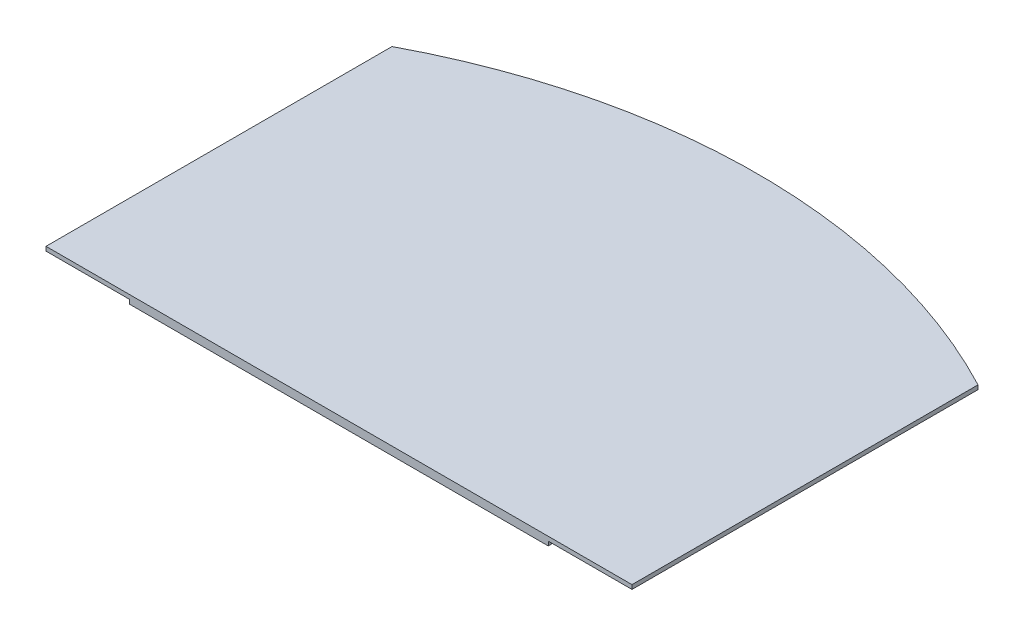
ISO-10303-21;
HEADER;
FILE_DESCRIPTION(('STEP AP214'),'2;1');
FILE_NAME('part.step','',(''),(''),'','','');
FILE_SCHEMA(('AUTOMOTIVE_DESIGN { 1 0 10303 214 1 1 1 1 }'));
ENDSEC;
DATA;
#1=APPLICATION_CONTEXT('core data for automotive mechanical design processes');
#2=APPLICATION_PROTOCOL_DEFINITION('international standard','automotive_design',2000,#1);
#3=PRODUCT_CONTEXT('',#1,'mechanical');
#4=PRODUCT('Part','Part','',(#3));
#5=PRODUCT_RELATED_PRODUCT_CATEGORY('part','',(#4));
#6=PRODUCT_DEFINITION_FORMATION('','',#4);
#7=PRODUCT_DEFINITION_CONTEXT('part definition',#1,'design');
#8=PRODUCT_DEFINITION('design','',#6,#7);
#9=PRODUCT_DEFINITION_SHAPE('','',#8);
#10=(LENGTH_UNIT() NAMED_UNIT(*) SI_UNIT(.MILLI.,.METRE.));
#11=(NAMED_UNIT(*) PLANE_ANGLE_UNIT() SI_UNIT($,.RADIAN.));
#12=(NAMED_UNIT(*) SI_UNIT($,.STERADIAN.) SOLID_ANGLE_UNIT());
#13=UNCERTAINTY_MEASURE_WITH_UNIT(LENGTH_MEASURE(1.E-05),#10,'distance_accuracy_value','');
#14=(GEOMETRIC_REPRESENTATION_CONTEXT(3) GLOBAL_UNCERTAINTY_ASSIGNED_CONTEXT((#13)) GLOBAL_UNIT_ASSIGNED_CONTEXT((#10,
#11,#12)) REPRESENTATION_CONTEXT('',''));
#15=CARTESIAN_POINT('',(0.,0.,0.));
#16=DIRECTION('',(0.,0.,1.));
#17=DIRECTION('',(1.,0.,0.));
#18=AXIS2_PLACEMENT_3D('',#15,#16,#17);
#19=CARTESIAN_POINT('',(70.,2.,-89.9792049636934));
#20=DIRECTION('',(-1.,0.,0.));
#21=DIRECTION('',(0.,0.,1.));
#22=AXIS2_PLACEMENT_3D('',#19,#20,#21);
#23=PLANE('',#22);
#24=DIRECTION('',(0.,0.,1.));
#25=VECTOR('',#24,1.);
#26=CARTESIAN_POINT('',(70.,1.,-222.143502841512));
#27=LINE('',#26,#25);
#28=CARTESIAN_POINT('',(70.,1.,-132.664991614216));
#29=VERTEX_POINT('',#28);
#30=CARTESIAN_POINT('',(70.,1.,-50.));
#31=VERTEX_POINT('',#30);
#32=EDGE_CURVE('E143',#29,#31,#27,.T.);
#33=ORIENTED_EDGE('',*,*,#32,.F.);
#34=DIRECTION('',(0.,-1.,0.));
#35=VECTOR('',#34,1.);
#36=CARTESIAN_POINT('',(70.,2.,-132.664991614216));
#37=LINE('',#36,#35);
#38=CARTESIAN_POINT('',(70.,2.,-132.664991614216));
#39=VERTEX_POINT('',#38);
#40=EDGE_CURVE('E43',#39,#29,#37,.T.);
#41=ORIENTED_EDGE('',*,*,#40,.F.);
#42=DIRECTION('',(0.,0.,-1.));
#43=VECTOR('',#42,1.);
#44=CARTESIAN_POINT('',(70.,2.,-89.9792049636934));
#45=LINE('',#44,#43);
#46=CARTESIAN_POINT('',(70.,2.,-50.));
#47=VERTEX_POINT('',#46);
#48=EDGE_CURVE('E125',#47,#39,#45,.T.);
#49=ORIENTED_EDGE('',*,*,#48,.F.);
#50=DIRECTION('',(0.,-1.,0.));
#51=VECTOR('',#50,1.);
#52=CARTESIAN_POINT('',(70.,2.,-50.));
#53=LINE('',#52,#51);
#54=EDGE_CURVE('E11',#47,#31,#53,.T.);
#55=ORIENTED_EDGE('',*,*,#54,.T.);
#56=EDGE_LOOP('',(#33,#41,#49,#55));
#57=FACE_BOUND('',#56,.T.);
#58=ADVANCED_FACE('F35',(#57),#23,.F.);
#59=CARTESIAN_POINT('',(0.,2.,0.));
#60=DIRECTION('',(0.,-1.,0.));
#61=DIRECTION('',(0.,0.,-1.));
#62=AXIS2_PLACEMENT_3D('',#59,#60,#61);
#63=CYLINDRICAL_SURFACE('',#62,150.);
#64=CARTESIAN_POINT('',(0.,1.,0.));
#65=DIRECTION('',(0.,-1.,0.));
#66=DIRECTION('',(0.,0.,-1.));
#67=AXIS2_PLACEMENT_3D('',#64,#65,#66);
#68=CIRCLE('',#67,150.);
#69=CARTESIAN_POINT('',(50.,1.,-141.42135623731));
#70=VERTEX_POINT('',#69);
#71=EDGE_CURVE('E50',#70,#29,#68,.T.);
#72=ORIENTED_EDGE('',*,*,#71,.F.);
#73=DIRECTION('',(0.,-1.,0.));
#74=VECTOR('',#73,1.);
#75=CARTESIAN_POINT('',(50.,1.,-141.42135623731));
#76=LINE('',#75,#74);
#77=CARTESIAN_POINT('',(50.,0.,-141.42135623731));
#78=VERTEX_POINT('',#77);
#79=EDGE_CURVE('E147',#70,#78,#76,.T.);
#80=ORIENTED_EDGE('',*,*,#79,.T.);
#81=CARTESIAN_POINT('',(0.,0.,0.));
#82=DIRECTION('',(0.,1.,0.));
#83=DIRECTION('',(0.,0.,1.));
#84=AXIS2_PLACEMENT_3D('',#81,#82,#83);
#85=CIRCLE('',#84,150.);
#86=CARTESIAN_POINT('',(-50.,0.,-141.42135623731));
#87=VERTEX_POINT('',#86);
#88=EDGE_CURVE('E58',#78,#87,#85,.T.);
#89=ORIENTED_EDGE('',*,*,#88,.T.);
#90=DIRECTION('',(0.,-1.,0.));
#91=VECTOR('',#90,1.);
#92=CARTESIAN_POINT('',(-50.,1.,-141.42135623731));
#93=LINE('',#92,#91);
#94=CARTESIAN_POINT('',(-50.,1.,-141.42135623731));
#95=VERTEX_POINT('',#94);
#96=EDGE_CURVE('E122',#95,#87,#93,.T.);
#97=ORIENTED_EDGE('',*,*,#96,.F.);
#98=CARTESIAN_POINT('',(0.,1.,0.));
#99=DIRECTION('',(0.,-1.,0.));
#100=DIRECTION('',(0.,0.,-1.));
#101=AXIS2_PLACEMENT_3D('',#98,#99,#100);
#102=CIRCLE('',#101,150.);
#103=CARTESIAN_POINT('',(-70.,1.,-132.664991614216));
#104=VERTEX_POINT('',#103);
#105=EDGE_CURVE('E159',#104,#95,#102,.T.);
#106=ORIENTED_EDGE('',*,*,#105,.F.);
#107=DIRECTION('',(0.,-1.,0.));
#108=VECTOR('',#107,1.);
#109=CARTESIAN_POINT('',(-70.,2.,-132.664991614216));
#110=LINE('',#109,#108);
#111=CARTESIAN_POINT('',(-70.,2.,-132.664991614216));
#112=VERTEX_POINT('',#111);
#113=EDGE_CURVE('E132',#112,#104,#110,.T.);
#114=ORIENTED_EDGE('',*,*,#113,.F.);
#115=CARTESIAN_POINT('',(0.,2.,0.));
#116=DIRECTION('',(0.,1.,0.));
#117=DIRECTION('',(0.,0.,1.));
#118=AXIS2_PLACEMENT_3D('',#115,#116,#117);
#119=CIRCLE('',#118,150.);
#120=EDGE_CURVE('E140',#39,#112,#119,.T.);
#121=ORIENTED_EDGE('',*,*,#120,.F.);
#122=ORIENTED_EDGE('',*,*,#40,.T.);
#123=EDGE_LOOP('',(#72,#80,#89,#97,#106,#114,#121,#122));
#124=FACE_BOUND('',#123,.T.);
#125=ADVANCED_FACE('F138',(#124),#63,.T.);
#126=CARTESIAN_POINT('',(-70.,2.,-89.9792049636934));
#127=DIRECTION('',(-1.,0.,0.));
#128=DIRECTION('',(0.,0.,1.));
#129=AXIS2_PLACEMENT_3D('',#126,#127,#128);
#130=PLANE('',#129);
#131=ORIENTED_EDGE('',*,*,#113,.T.);
#132=DIRECTION('',(0.,0.,-1.));
#133=VECTOR('',#132,1.);
#134=CARTESIAN_POINT('',(-70.,1.,-233.564134102725));
#135=LINE('',#134,#133);
#136=CARTESIAN_POINT('',(-70.,1.,-50.));
#137=VERTEX_POINT('',#136);
#138=EDGE_CURVE('E157',#137,#104,#135,.T.);
#139=ORIENTED_EDGE('',*,*,#138,.F.);
#140=DIRECTION('',(0.,-1.,0.));
#141=VECTOR('',#140,1.);
#142=CARTESIAN_POINT('',(-70.,2.,-50.));
#143=LINE('',#142,#141);
#144=CARTESIAN_POINT('',(-70.,2.,-50.));
#145=VERTEX_POINT('',#144);
#146=EDGE_CURVE('E130',#145,#137,#143,.T.);
#147=ORIENTED_EDGE('',*,*,#146,.F.);
#148=DIRECTION('',(0.,0.,-1.));
#149=VECTOR('',#148,1.);
#150=CARTESIAN_POINT('',(-70.,2.,-89.9792049636934));
#151=LINE('',#150,#149);
#152=EDGE_CURVE('E133',#145,#112,#151,.T.);
#153=ORIENTED_EDGE('',*,*,#152,.T.);
#154=EDGE_LOOP('',(#131,#139,#147,#153));
#155=FACE_BOUND('',#154,.T.);
#156=ADVANCED_FACE('F177',(#155),#130,.T.);
#157=CARTESIAN_POINT('',(-143.584929139032,2.,-50.));
#158=DIRECTION('',(0.,0.,1.));
#159=DIRECTION('',(1.,0.,0.));
#160=AXIS2_PLACEMENT_3D('',#157,#158,#159);
#161=PLANE('',#160);
#162=ORIENTED_EDGE('',*,*,#146,.T.);
#163=DIRECTION('',(-1.,0.,0.));
#164=VECTOR('',#163,1.);
#165=CARTESIAN_POINT('',(0.,1.,-50.));
#166=LINE('',#165,#164);
#167=CARTESIAN_POINT('',(-50.,1.,-50.));
#168=VERTEX_POINT('',#167);
#169=EDGE_CURVE('E108',#168,#137,#166,.T.);
#170=ORIENTED_EDGE('',*,*,#169,.F.);
#171=DIRECTION('',(0.,-1.,0.));
#172=VECTOR('',#171,1.);
#173=CARTESIAN_POINT('',(-50.,2.,-50.));
#174=LINE('',#173,#172);
#175=CARTESIAN_POINT('',(-50.,0.,-50.));
#176=VERTEX_POINT('',#175);
#177=EDGE_CURVE('E102',#168,#176,#174,.T.);
#178=ORIENTED_EDGE('',*,*,#177,.T.);
#179=DIRECTION('',(1.,0.,0.));
#180=VECTOR('',#179,1.);
#181=CARTESIAN_POINT('',(-50.,0.,-50.));
#182=LINE('',#181,#180);
#183=CARTESIAN_POINT('',(50.,0.,-50.));
#184=VERTEX_POINT('',#183);
#185=EDGE_CURVE('E106',#176,#184,#182,.T.);
#186=ORIENTED_EDGE('',*,*,#185,.T.);
#187=DIRECTION('',(0.,-1.,0.));
#188=VECTOR('',#187,1.);
#189=CARTESIAN_POINT('',(50.,2.,-50.));
#190=LINE('',#189,#188);
#191=CARTESIAN_POINT('',(50.,1.,-50.));
#192=VERTEX_POINT('',#191);
#193=EDGE_CURVE('E112',#192,#184,#190,.T.);
#194=ORIENTED_EDGE('',*,*,#193,.F.);
#195=DIRECTION('',(-1.,0.,0.));
#196=VECTOR('',#195,1.);
#197=CARTESIAN_POINT('',(10.,1.,-50.));
#198=LINE('',#197,#196);
#199=EDGE_CURVE('E168',#31,#192,#198,.T.);
#200=ORIENTED_EDGE('',*,*,#199,.F.);
#201=ORIENTED_EDGE('',*,*,#54,.F.);
#202=DIRECTION('',(1.,0.,0.));
#203=VECTOR('',#202,1.);
#204=CARTESIAN_POINT('',(-143.584929139032,2.,-50.));
#205=LINE('',#204,#203);
#206=EDGE_CURVE('E123',#145,#47,#205,.T.);
#207=ORIENTED_EDGE('',*,*,#206,.F.);
#208=EDGE_LOOP('',(#162,#170,#178,#186,#194,#200,#201,#207));
#209=FACE_BOUND('',#208,.T.);
#210=ADVANCED_FACE('F105',(#209),#161,.T.);
#211=CARTESIAN_POINT('',(-143.584929139032,0.,-89.9792049636934));
#212=DIRECTION('',(0.,1.,0.));
#213=DIRECTION('',(0.,0.,1.));
#214=AXIS2_PLACEMENT_3D('',#211,#212,#213);
#215=PLANE('',#214);
#216=DIRECTION('',(0.,0.,-1.));
#217=VECTOR('',#216,1.);
#218=CARTESIAN_POINT('',(50.,0.,-89.9792049636934));
#219=LINE('',#218,#217);
#220=EDGE_CURVE('E119',#184,#78,#219,.T.);
#221=ORIENTED_EDGE('',*,*,#220,.F.);
#222=ORIENTED_EDGE('',*,*,#185,.F.);
#223=DIRECTION('',(0.,0.,1.));
#224=VECTOR('',#223,1.);
#225=CARTESIAN_POINT('',(-50.,0.,-89.9792049636934));
#226=LINE('',#225,#224);
#227=EDGE_CURVE('E117',#87,#176,#226,.T.);
#228=ORIENTED_EDGE('',*,*,#227,.F.);
#229=ORIENTED_EDGE('',*,*,#88,.F.);
#230=EDGE_LOOP('',(#221,#222,#228,#229));
#231=FACE_BOUND('',#230,.T.);
#232=ADVANCED_FACE('F116',(#231),#215,.F.);
#233=CARTESIAN_POINT('',(50.,2.,-89.9792049636934));
#234=DIRECTION('',(-1.,0.,0.));
#235=DIRECTION('',(0.,0.,1.));
#236=AXIS2_PLACEMENT_3D('',#233,#234,#235);
#237=PLANE('',#236);
#238=DIRECTION('',(0.,0.,-1.));
#239=VECTOR('',#238,1.);
#240=CARTESIAN_POINT('',(50.,1.,-222.143502841512));
#241=LINE('',#240,#239);
#242=EDGE_CURVE('E151',#192,#70,#241,.T.);
#243=ORIENTED_EDGE('',*,*,#242,.F.);
#244=ORIENTED_EDGE('',*,*,#193,.T.);
#245=ORIENTED_EDGE('',*,*,#220,.T.);
#246=ORIENTED_EDGE('',*,*,#79,.F.);
#247=EDGE_LOOP('',(#243,#244,#245,#246));
#248=FACE_BOUND('',#247,.T.);
#249=ADVANCED_FACE('F37',(#248),#237,.F.);
#250=CARTESIAN_POINT('',(-50.,2.,-89.9792049636934));
#251=DIRECTION('',(1.,0.,0.));
#252=DIRECTION('',(0.,0.,-1.));
#253=AXIS2_PLACEMENT_3D('',#250,#251,#252);
#254=PLANE('',#253);
#255=ORIENTED_EDGE('',*,*,#227,.T.);
#256=ORIENTED_EDGE('',*,*,#177,.F.);
#257=DIRECTION('',(0.,0.,-1.));
#258=VECTOR('',#257,1.);
#259=CARTESIAN_POINT('',(-50.,1.,-233.564134102725));
#260=LINE('',#259,#258);
#261=EDGE_CURVE('E149',#168,#95,#260,.T.);
#262=ORIENTED_EDGE('',*,*,#261,.T.);
#263=ORIENTED_EDGE('',*,*,#96,.T.);
#264=EDGE_LOOP('',(#255,#256,#262,#263));
#265=FACE_BOUND('',#264,.T.);
#266=ADVANCED_FACE('F121',(#265),#254,.F.);
#267=CARTESIAN_POINT('',(-143.584929139032,2.,-89.9792049636934));
#268=DIRECTION('',(0.,1.,0.));
#269=DIRECTION('',(0.,0.,1.));
#270=AXIS2_PLACEMENT_3D('',#267,#268,#269);
#271=PLANE('',#270);
#272=ORIENTED_EDGE('',*,*,#152,.F.);
#273=ORIENTED_EDGE('',*,*,#206,.T.);
#274=ORIENTED_EDGE('',*,*,#48,.T.);
#275=ORIENTED_EDGE('',*,*,#120,.T.);
#276=EDGE_LOOP('',(#272,#273,#274,#275));
#277=FACE_BOUND('',#276,.T.);
#278=ADVANCED_FACE('F178',(#277),#271,.T.);
#279=CARTESIAN_POINT('',(0.,1.,-233.564134102725));
#280=DIRECTION('',(0.,-1.,0.));
#281=DIRECTION('',(0.,0.,-1.));
#282=AXIS2_PLACEMENT_3D('',#279,#280,#281);
#283=PLANE('',#282);
#284=ORIENTED_EDGE('',*,*,#261,.F.);
#285=ORIENTED_EDGE('',*,*,#169,.T.);
#286=ORIENTED_EDGE('',*,*,#138,.T.);
#287=ORIENTED_EDGE('',*,*,#105,.T.);
#288=EDGE_LOOP('',(#284,#285,#286,#287));
#289=FACE_BOUND('',#288,.T.);
#290=ADVANCED_FACE('F181',(#289),#283,.T.);
#291=CARTESIAN_POINT('',(10.,1.,-222.143502841512));
#292=DIRECTION('',(0.,-1.,0.));
#293=DIRECTION('',(0.,0.,-1.));
#294=AXIS2_PLACEMENT_3D('',#291,#292,#293);
#295=PLANE('',#294);
#296=ORIENTED_EDGE('',*,*,#199,.T.);
#297=ORIENTED_EDGE('',*,*,#242,.T.);
#298=ORIENTED_EDGE('',*,*,#71,.T.);
#299=ORIENTED_EDGE('',*,*,#32,.T.);
#300=EDGE_LOOP('',(#296,#297,#298,#299));
#301=FACE_BOUND('',#300,.T.);
#302=ADVANCED_FACE('F171',(#301),#295,.T.);
#303=CLOSED_SHELL('',(#58,#125,#156,#210,#232,#249,#266,#278,#290,#302));
#304=MANIFOLD_SOLID_BREP('B2',#303);
#305=ADVANCED_BREP_SHAPE_REPRESENTATION('',(#18,#304),#14);
#306=SHAPE_DEFINITION_REPRESENTATION(#9,#305);
ENDSEC;
END-ISO-10303-21;
